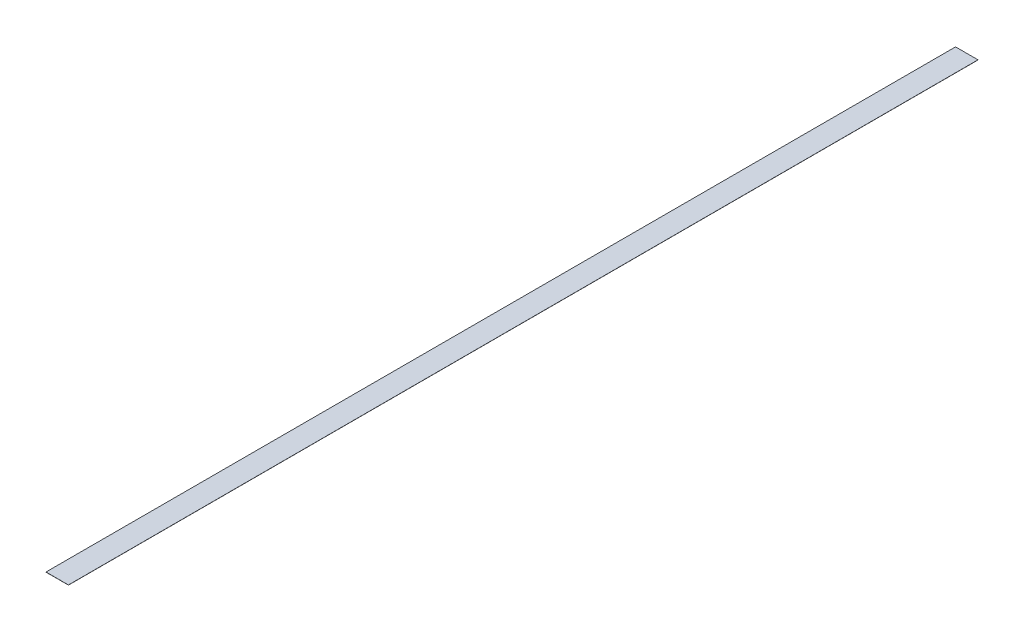
ISO-10303-21;
HEADER;
FILE_DESCRIPTION(('STEP AP214'),'2;1');
FILE_NAME('part.step','',(''),(''),'','','');
FILE_SCHEMA(('AUTOMOTIVE_DESIGN { 1 0 10303 214 1 1 1 1 }'));
ENDSEC;
DATA;
#1=APPLICATION_CONTEXT('core data for automotive mechanical design processes');
#2=APPLICATION_PROTOCOL_DEFINITION('international standard','automotive_design',2000,#1);
#3=PRODUCT_CONTEXT('',#1,'mechanical');
#4=PRODUCT('Part','Part','',(#3));
#5=PRODUCT_RELATED_PRODUCT_CATEGORY('part','',(#4));
#6=PRODUCT_DEFINITION_FORMATION('','',#4);
#7=PRODUCT_DEFINITION_CONTEXT('part definition',#1,'design');
#8=PRODUCT_DEFINITION('design','',#6,#7);
#9=PRODUCT_DEFINITION_SHAPE('','',#8);
#10=(LENGTH_UNIT() NAMED_UNIT(*) SI_UNIT(.MILLI.,.METRE.));
#11=(NAMED_UNIT(*) PLANE_ANGLE_UNIT() SI_UNIT($,.RADIAN.));
#12=(NAMED_UNIT(*) SI_UNIT($,.STERADIAN.) SOLID_ANGLE_UNIT());
#13=UNCERTAINTY_MEASURE_WITH_UNIT(LENGTH_MEASURE(1.E-05),#10,'distance_accuracy_value','');
#14=(GEOMETRIC_REPRESENTATION_CONTEXT(3) GLOBAL_UNCERTAINTY_ASSIGNED_CONTEXT((#13)) GLOBAL_UNIT_ASSIGNED_CONTEXT((#10,
#11,#12)) REPRESENTATION_CONTEXT('',''));
#15=CARTESIAN_POINT('',(0.,0.,0.));
#16=DIRECTION('',(0.,0.,1.));
#17=DIRECTION('',(1.,0.,0.));
#18=AXIS2_PLACEMENT_3D('',#15,#16,#17);
#19=CARTESIAN_POINT('',(0.,0.1,0.));
#20=DIRECTION('',(0.,0.,-1.));
#21=DIRECTION('',(-1.,0.,0.));
#22=AXIS2_PLACEMENT_3D('',#19,#20,#21);
#23=PLANE('',#22);
#24=DIRECTION('',(1.,0.,0.));
#25=VECTOR('',#24,1.);
#26=CARTESIAN_POINT('',(0.,0.,0.));
#27=LINE('',#26,#25);
#28=CARTESIAN_POINT('',(0.,0.,0.));
#29=VERTEX_POINT('',#28);
#30=CARTESIAN_POINT('',(14.9999999999999,0.,0.));
#31=VERTEX_POINT('',#30);
#32=EDGE_CURVE('E99',#29,#31,#27,.T.);
#33=ORIENTED_EDGE('',*,*,#32,.F.);
#34=DIRECTION('',(0.,-1.,0.));
#35=VECTOR('',#34,1.);
#36=CARTESIAN_POINT('',(0.,0.1,0.));
#37=LINE('',#36,#35);
#38=CARTESIAN_POINT('',(0.,0.1,0.));
#39=VERTEX_POINT('',#38);
#40=EDGE_CURVE('E11',#39,#29,#37,.T.);
#41=ORIENTED_EDGE('',*,*,#40,.F.);
#42=DIRECTION('',(1.,0.,0.));
#43=VECTOR('',#42,1.);
#44=CARTESIAN_POINT('',(0.,0.1,0.));
#45=LINE('',#44,#43);
#46=CARTESIAN_POINT('',(14.9999999999999,0.1,0.));
#47=VERTEX_POINT('',#46);
#48=EDGE_CURVE('E94',#39,#47,#45,.T.);
#49=ORIENTED_EDGE('',*,*,#48,.T.);
#50=DIRECTION('',(0.,-1.,0.));
#51=VECTOR('',#50,1.);
#52=CARTESIAN_POINT('',(14.9999999999999,0.1,0.));
#53=LINE('',#52,#51);
#54=EDGE_CURVE('E37',#47,#31,#53,.T.);
#55=ORIENTED_EDGE('',*,*,#54,.T.);
#56=EDGE_LOOP('',(#33,#41,#49,#55));
#57=FACE_BOUND('',#56,.T.);
#58=ADVANCED_FACE('F34',(#57),#23,.T.);
#59=CARTESIAN_POINT('',(0.,0.1,0.));
#60=DIRECTION('',(1.,0.,0.));
#61=DIRECTION('',(0.,0.,-1.));
#62=AXIS2_PLACEMENT_3D('',#59,#60,#61);
#63=PLANE('',#62);
#64=DIRECTION('',(0.,0.,1.));
#65=VECTOR('',#64,1.);
#66=CARTESIAN_POINT('',(0.,0.,0.));
#67=LINE('',#66,#65);
#68=CARTESIAN_POINT('',(0.,0.,608.));
#69=VERTEX_POINT('',#68);
#70=EDGE_CURVE('E67',#29,#69,#67,.T.);
#71=ORIENTED_EDGE('',*,*,#70,.T.);
#72=DIRECTION('',(0.,-1.,0.));
#73=VECTOR('',#72,1.);
#74=CARTESIAN_POINT('',(0.,0.1,608.));
#75=LINE('',#74,#73);
#76=CARTESIAN_POINT('',(0.,0.1,608.));
#77=VERTEX_POINT('',#76);
#78=EDGE_CURVE('E43',#77,#69,#75,.T.);
#79=ORIENTED_EDGE('',*,*,#78,.F.);
#80=DIRECTION('',(0.,0.,1.));
#81=VECTOR('',#80,1.);
#82=CARTESIAN_POINT('',(0.,0.1,0.));
#83=LINE('',#82,#81);
#84=EDGE_CURVE('E84',#39,#77,#83,.T.);
#85=ORIENTED_EDGE('',*,*,#84,.F.);
#86=ORIENTED_EDGE('',*,*,#40,.T.);
#87=EDGE_LOOP('',(#71,#79,#85,#86));
#88=FACE_BOUND('',#87,.T.);
#89=ADVANCED_FACE('F109',(#88),#63,.F.);
#90=CARTESIAN_POINT('',(0.,0.1,608.));
#91=DIRECTION('',(0.,0.,-1.));
#92=DIRECTION('',(-1.,0.,0.));
#93=AXIS2_PLACEMENT_3D('',#90,#91,#92);
#94=PLANE('',#93);
#95=DIRECTION('',(1.,0.,0.));
#96=VECTOR('',#95,1.);
#97=CARTESIAN_POINT('',(0.,0.,608.));
#98=LINE('',#97,#96);
#99=CARTESIAN_POINT('',(15.0000000000001,0.,608.));
#100=VERTEX_POINT('',#99);
#101=EDGE_CURVE('E91',#69,#100,#98,.T.);
#102=ORIENTED_EDGE('',*,*,#101,.T.);
#103=DIRECTION('',(0.,-1.,0.));
#104=VECTOR('',#103,1.);
#105=CARTESIAN_POINT('',(15.0000000000001,0.1,608.));
#106=LINE('',#105,#104);
#107=CARTESIAN_POINT('',(15.0000000000001,0.1,608.));
#108=VERTEX_POINT('',#107);
#109=EDGE_CURVE('E88',#108,#100,#106,.T.);
#110=ORIENTED_EDGE('',*,*,#109,.F.);
#111=DIRECTION('',(1.,0.,0.));
#112=VECTOR('',#111,1.);
#113=CARTESIAN_POINT('',(0.,0.1,608.));
#114=LINE('',#113,#112);
#115=EDGE_CURVE('E79',#77,#108,#114,.T.);
#116=ORIENTED_EDGE('',*,*,#115,.F.);
#117=ORIENTED_EDGE('',*,*,#78,.T.);
#118=EDGE_LOOP('',(#102,#110,#116,#117));
#119=FACE_BOUND('',#118,.T.);
#120=ADVANCED_FACE('F89',(#119),#94,.F.);
#121=CARTESIAN_POINT('',(14.9999999999999,0.1,0.));
#122=DIRECTION('',(1.,0.,0.));
#123=DIRECTION('',(0.,0.,-1.));
#124=AXIS2_PLACEMENT_3D('',#121,#122,#123);
#125=PLANE('',#124);
#126=DIRECTION('',(0.,0.,1.));
#127=VECTOR('',#126,1.);
#128=CARTESIAN_POINT('',(14.9999999999999,0.,0.));
#129=LINE('',#128,#127);
#130=EDGE_CURVE('E102',#31,#100,#129,.T.);
#131=ORIENTED_EDGE('',*,*,#130,.F.);
#132=ORIENTED_EDGE('',*,*,#54,.F.);
#133=DIRECTION('',(0.,0.,1.));
#134=VECTOR('',#133,1.);
#135=CARTESIAN_POINT('',(14.9999999999999,0.1,0.));
#136=LINE('',#135,#134);
#137=EDGE_CURVE('E83',#47,#108,#136,.T.);
#138=ORIENTED_EDGE('',*,*,#137,.T.);
#139=ORIENTED_EDGE('',*,*,#109,.T.);
#140=EDGE_LOOP('',(#131,#132,#138,#139));
#141=FACE_BOUND('',#140,.T.);
#142=ADVANCED_FACE('F93',(#141),#125,.T.);
#143=CARTESIAN_POINT('',(0.,0.1,0.));
#144=DIRECTION('',(0.,-1.,0.));
#145=DIRECTION('',(0.,0.,-1.));
#146=AXIS2_PLACEMENT_3D('',#143,#144,#145);
#147=PLANE('',#146);
#148=ORIENTED_EDGE('',*,*,#48,.F.);
#149=ORIENTED_EDGE('',*,*,#84,.T.);
#150=ORIENTED_EDGE('',*,*,#115,.T.);
#151=ORIENTED_EDGE('',*,*,#137,.F.);
#152=EDGE_LOOP('',(#148,#149,#150,#151));
#153=FACE_BOUND('',#152,.T.);
#154=ADVANCED_FACE('F82',(#153),#147,.F.);
#155=CARTESIAN_POINT('',(0.,0.,0.));
#156=DIRECTION('',(0.,-1.,0.));
#157=DIRECTION('',(0.,0.,-1.));
#158=AXIS2_PLACEMENT_3D('',#155,#156,#157);
#159=PLANE('',#158);
#160=ORIENTED_EDGE('',*,*,#32,.T.);
#161=ORIENTED_EDGE('',*,*,#130,.T.);
#162=ORIENTED_EDGE('',*,*,#101,.F.);
#163=ORIENTED_EDGE('',*,*,#70,.F.);
#164=EDGE_LOOP('',(#160,#161,#162,#163));
#165=FACE_BOUND('',#164,.T.);
#166=ADVANCED_FACE('F107',(#165),#159,.T.);
#167=CLOSED_SHELL('',(#58,#89,#120,#142,#154,#166));
#168=MANIFOLD_SOLID_BREP('B2',#167);
#169=ADVANCED_BREP_SHAPE_REPRESENTATION('',(#18,#168),#14);
#170=SHAPE_DEFINITION_REPRESENTATION(#9,#169);
ENDSEC;
END-ISO-10303-21;
